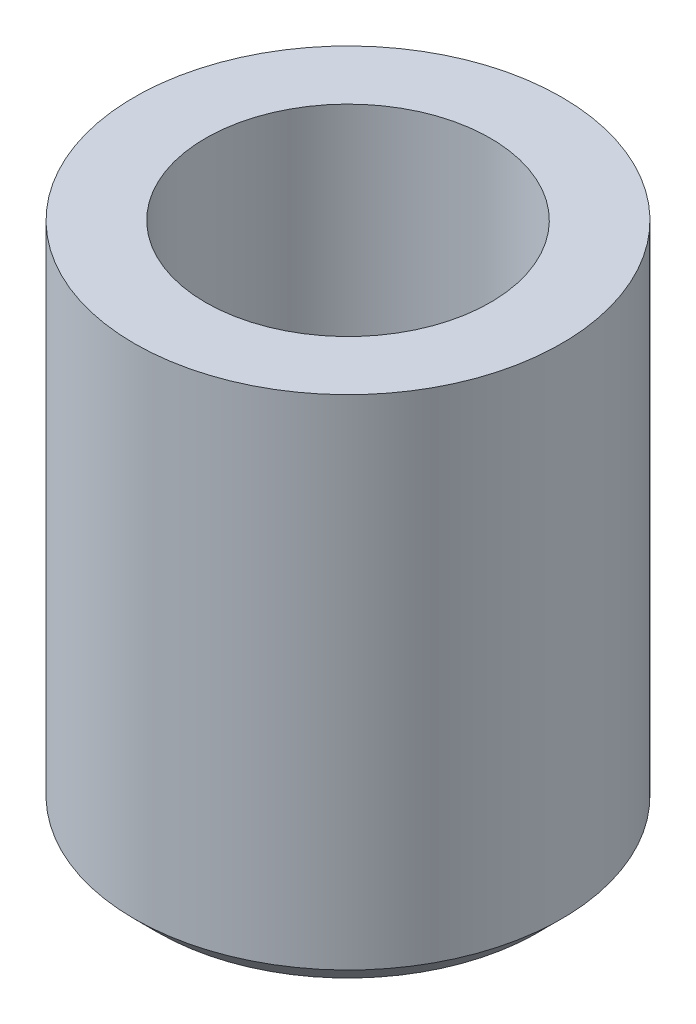
ISO-10303-21;
HEADER;
FILE_DESCRIPTION(('STEP AP214'),'2;1');
FILE_NAME('part.step','',(''),(''),'','','');
FILE_SCHEMA(('AUTOMOTIVE_DESIGN { 1 0 10303 214 1 1 1 1 }'));
ENDSEC;
DATA;
#1=APPLICATION_CONTEXT('core data for automotive mechanical design processes');
#2=APPLICATION_PROTOCOL_DEFINITION('international standard','automotive_design',2000,#1);
#3=PRODUCT_CONTEXT('',#1,'mechanical');
#4=PRODUCT('Part','Part','',(#3));
#5=PRODUCT_RELATED_PRODUCT_CATEGORY('part','',(#4));
#6=PRODUCT_DEFINITION_FORMATION('','',#4);
#7=PRODUCT_DEFINITION_CONTEXT('part definition',#1,'design');
#8=PRODUCT_DEFINITION('design','',#6,#7);
#9=PRODUCT_DEFINITION_SHAPE('','',#8);
#10=(LENGTH_UNIT() NAMED_UNIT(*) SI_UNIT(.MILLI.,.METRE.));
#11=(NAMED_UNIT(*) PLANE_ANGLE_UNIT() SI_UNIT($,.RADIAN.));
#12=(NAMED_UNIT(*) SI_UNIT($,.STERADIAN.) SOLID_ANGLE_UNIT());
#13=UNCERTAINTY_MEASURE_WITH_UNIT(LENGTH_MEASURE(1.E-05),#10,'distance_accuracy_value','');
#14=(GEOMETRIC_REPRESENTATION_CONTEXT(3) GLOBAL_UNCERTAINTY_ASSIGNED_CONTEXT((#13)) GLOBAL_UNIT_ASSIGNED_CONTEXT((#10,
#11,#12)) REPRESENTATION_CONTEXT('',''));
#15=CARTESIAN_POINT('',(0.,0.,0.));
#16=DIRECTION('',(0.,0.,1.));
#17=DIRECTION('',(1.,0.,0.));
#18=AXIS2_PLACEMENT_3D('',#15,#16,#17);
#19=CARTESIAN_POINT('',(0.,11.,0.));
#20=DIRECTION('',(0.,-1.,0.));
#21=DIRECTION('',(0.,0.,-1.));
#22=AXIS2_PLACEMENT_3D('',#19,#20,#21);
#23=CYLINDRICAL_SURFACE('',#22,4.5);
#24=CARTESIAN_POINT('',(0.,0.499999999999997,0.));
#25=DIRECTION('',(0.,1.,0.));
#26=DIRECTION('',(0.,0.,1.));
#27=AXIS2_PLACEMENT_3D('',#24,#25,#26);
#28=CIRCLE('',#27,4.5);
#29=CARTESIAN_POINT('',(0.,0.499999999999997,4.5));
#30=VERTEX_POINT('',#29);
#31=EDGE_CURVE('E48',#30,#30,#28,.T.);
#32=ORIENTED_EDGE('',*,*,#31,.T.);
#33=EDGE_LOOP('',(#32));
#34=FACE_BOUND('',#33,.T.);
#35=CARTESIAN_POINT('',(0.,11.,0.));
#36=DIRECTION('',(0.,1.,0.));
#37=DIRECTION('',(0.,0.,1.));
#38=AXIS2_PLACEMENT_3D('',#35,#36,#37);
#39=CIRCLE('',#38,4.5);
#40=CARTESIAN_POINT('',(0.,11.,4.5));
#41=VERTEX_POINT('',#40);
#42=EDGE_CURVE('E53',#41,#41,#39,.T.);
#43=ORIENTED_EDGE('',*,*,#42,.F.);
#44=EDGE_LOOP('',(#43));
#45=FACE_BOUND('',#44,.T.);
#46=ADVANCED_FACE('F39',(#34,#45),#23,.T.);
#47=CARTESIAN_POINT('',(0.,11.,0.));
#48=DIRECTION('',(0.,1.,0.));
#49=DIRECTION('',(0.,0.,1.));
#50=AXIS2_PLACEMENT_3D('',#47,#48,#49);
#51=PLANE('',#50);
#52=CARTESIAN_POINT('',(0.,11.,0.));
#53=DIRECTION('',(0.,1.,0.));
#54=DIRECTION('',(0.,0.,1.));
#55=AXIS2_PLACEMENT_3D('',#52,#53,#54);
#56=CIRCLE('',#55,3.);
#57=CARTESIAN_POINT('',(0.,11.,3.));
#58=VERTEX_POINT('',#57);
#59=EDGE_CURVE('E61',#58,#58,#56,.T.);
#60=ORIENTED_EDGE('',*,*,#59,.F.);
#61=EDGE_LOOP('',(#60));
#62=FACE_BOUND('',#61,.T.);
#63=ORIENTED_EDGE('',*,*,#42,.T.);
#64=EDGE_LOOP('',(#63));
#65=FACE_BOUND('',#64,.T.);
#66=ADVANCED_FACE('F78',(#62,#65),#51,.T.);
#67=CARTESIAN_POINT('',(0.,0.,0.));
#68=DIRECTION('',(0.,1.,0.));
#69=DIRECTION('',(0.,0.,1.));
#70=AXIS2_PLACEMENT_3D('',#67,#68,#69);
#71=PLANE('',#70);
#72=CARTESIAN_POINT('',(0.,0.,0.));
#73=DIRECTION('',(0.,1.,0.));
#74=DIRECTION('',(0.,0.,1.));
#75=AXIS2_PLACEMENT_3D('',#72,#73,#74);
#76=CIRCLE('',#75,4.);
#77=CARTESIAN_POINT('',(0.,0.,4.));
#78=VERTEX_POINT('',#77);
#79=EDGE_CURVE('E10',#78,#78,#76,.F.);
#80=ORIENTED_EDGE('',*,*,#79,.T.);
#81=EDGE_LOOP('',(#80));
#82=FACE_BOUND('',#81,.T.);
#83=ADVANCED_FACE('F74',(#82),#71,.F.);
#84=CARTESIAN_POINT('',(0.,3.,0.));
#85=DIRECTION('',(0.,1.,0.));
#86=DIRECTION('',(0.,0.,1.));
#87=AXIS2_PLACEMENT_3D('',#84,#85,#86);
#88=CYLINDRICAL_SURFACE('',#87,3.);
#89=CARTESIAN_POINT('',(0.,3.,0.));
#90=DIRECTION('',(0.,1.,0.));
#91=DIRECTION('',(0.,0.,1.));
#92=AXIS2_PLACEMENT_3D('',#89,#90,#91);
#93=CIRCLE('',#92,3.);
#94=CARTESIAN_POINT('',(0.,3.,3.));
#95=VERTEX_POINT('',#94);
#96=EDGE_CURVE('E58',#95,#95,#93,.T.);
#97=ORIENTED_EDGE('',*,*,#96,.F.);
#98=EDGE_LOOP('',(#97));
#99=FACE_BOUND('',#98,.T.);
#100=ORIENTED_EDGE('',*,*,#59,.T.);
#101=EDGE_LOOP('',(#100));
#102=FACE_BOUND('',#101,.T.);
#103=ADVANCED_FACE('F71',(#99,#102),#88,.F.);
#104=CARTESIAN_POINT('',(0.,3.,0.));
#105=DIRECTION('',(0.,1.,0.));
#106=DIRECTION('',(0.,0.,1.));
#107=AXIS2_PLACEMENT_3D('',#104,#105,#106);
#108=PLANE('',#107);
#109=ORIENTED_EDGE('',*,*,#96,.T.);
#110=EDGE_LOOP('',(#109));
#111=FACE_BOUND('',#110,.T.);
#112=ADVANCED_FACE('F69',(#111),#108,.T.);
#113=CARTESIAN_POINT('',(0.,0.499999999999997,0.));
#114=DIRECTION('',(0.,1.,0.));
#115=DIRECTION('',(0.,0.,1.));
#116=AXIS2_PLACEMENT_3D('',#113,#114,#115);
#117=CONICAL_SURFACE('',#116,4.5,0.785398163397453);
#118=ORIENTED_EDGE('',*,*,#79,.F.);
#119=EDGE_LOOP('',(#118));
#120=FACE_BOUND('',#119,.T.);
#121=ORIENTED_EDGE('',*,*,#31,.F.);
#122=EDGE_LOOP('',(#121));
#123=FACE_BOUND('',#122,.T.);
#124=ADVANCED_FACE('F42',(#120,#123),#117,.T.);
#125=CLOSED_SHELL('',(#46,#66,#83,#103,#112,#124));
#126=MANIFOLD_SOLID_BREP('B2',#125);
#127=ADVANCED_BREP_SHAPE_REPRESENTATION('',(#18,#126),#14);
#128=SHAPE_DEFINITION_REPRESENTATION(#9,#127);
ENDSEC;
END-ISO-10303-21;
